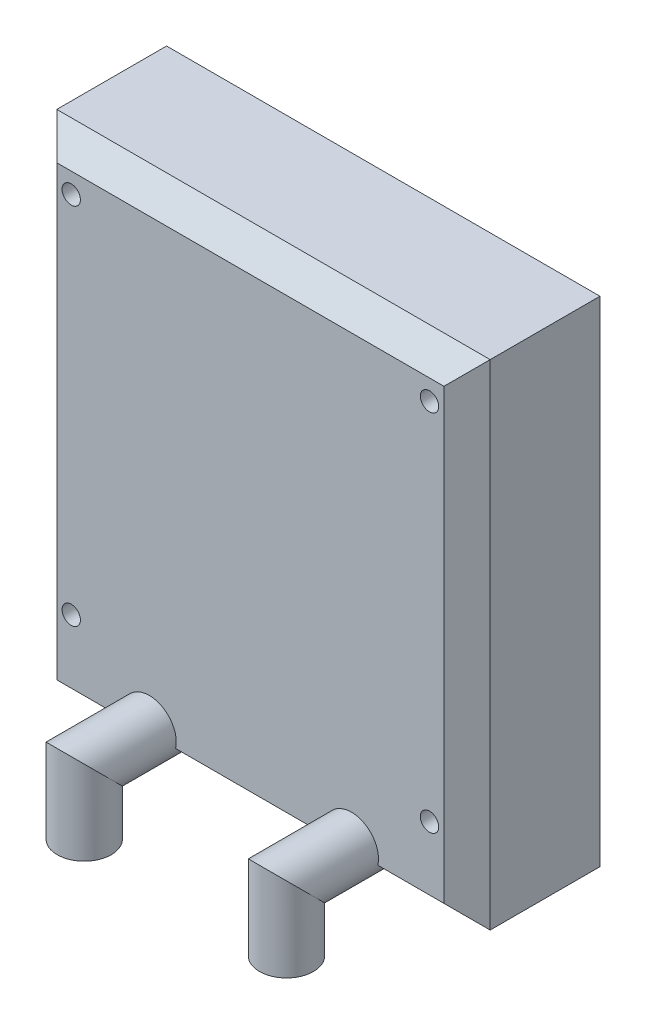
ISO-10303-21;
HEADER;
FILE_DESCRIPTION(('STEP AP214'),'2;1');
FILE_NAME('part.step','',(''),(''),'','','');
FILE_SCHEMA(('AUTOMOTIVE_DESIGN { 1 0 10303 214 1 1 1 1 }'));
ENDSEC;
DATA;
#1=APPLICATION_CONTEXT('core data for automotive mechanical design processes');
#2=APPLICATION_PROTOCOL_DEFINITION('international standard','automotive_design',2000,#1);
#3=PRODUCT_CONTEXT('',#1,'mechanical');
#4=PRODUCT('Part','Part','',(#3));
#5=PRODUCT_RELATED_PRODUCT_CATEGORY('part','',(#4));
#6=PRODUCT_DEFINITION_FORMATION('','',#4);
#7=PRODUCT_DEFINITION_CONTEXT('part definition',#1,'design');
#8=PRODUCT_DEFINITION('design','',#6,#7);
#9=PRODUCT_DEFINITION_SHAPE('','',#8);
#10=(LENGTH_UNIT() NAMED_UNIT(*) SI_UNIT(.MILLI.,.METRE.));
#11=(NAMED_UNIT(*) PLANE_ANGLE_UNIT() SI_UNIT($,.RADIAN.));
#12=(NAMED_UNIT(*) SI_UNIT($,.STERADIAN.) SOLID_ANGLE_UNIT());
#13=UNCERTAINTY_MEASURE_WITH_UNIT(LENGTH_MEASURE(1.E-05),#10,'distance_accuracy_value','');
#14=(GEOMETRIC_REPRESENTATION_CONTEXT(3) GLOBAL_UNCERTAINTY_ASSIGNED_CONTEXT((#13)) GLOBAL_UNIT_ASSIGNED_CONTEXT((#10,
#11,#12)) REPRESENTATION_CONTEXT('',''));
#15=CARTESIAN_POINT('',(0.,0.,0.));
#16=DIRECTION('',(0.,0.,1.));
#17=DIRECTION('',(1.,0.,0.));
#18=AXIS2_PLACEMENT_3D('',#15,#16,#17);
#19=CARTESIAN_POINT('',(-75.,-85.5,54.));
#20=DIRECTION('',(-1.,0.,0.));
#21=DIRECTION('',(0.,0.,1.));
#22=AXIS2_PLACEMENT_3D('',#19,#20,#21);
#23=PLANE('',#22);
#24=DIRECTION('',(0.,0.,-1.));
#25=VECTOR('',#24,1.);
#26=CARTESIAN_POINT('',(-75.,85.5,54.));
#27=LINE('',#26,#25);
#28=CARTESIAN_POINT('',(-75.,85.5,46.));
#29=VERTEX_POINT('',#28);
#30=CARTESIAN_POINT('',(-75.,85.5,8.00000000000004));
#31=VERTEX_POINT('',#30);
#32=EDGE_CURVE('E186',#29,#31,#27,.T.);
#33=ORIENTED_EDGE('',*,*,#32,.T.);
#34=DIRECTION('',(0.,-1.,0.));
#35=VECTOR('',#34,1.);
#36=CARTESIAN_POINT('',(-75.,-85.5,8.00000000000004));
#37=LINE('',#36,#35);
#38=CARTESIAN_POINT('',(-75.,-85.5,8.00000000000004));
#39=VERTEX_POINT('',#38);
#40=EDGE_CURVE('E217',#31,#39,#37,.T.);
#41=ORIENTED_EDGE('',*,*,#40,.T.);
#42=DIRECTION('',(0.,0.,-1.));
#43=VECTOR('',#42,1.);
#44=CARTESIAN_POINT('',(-75.,-85.5,54.));
#45=LINE('',#44,#43);
#46=CARTESIAN_POINT('',(-75.,-85.5,46.));
#47=VERTEX_POINT('',#46);
#48=EDGE_CURVE('E189',#47,#39,#45,.T.);
#49=ORIENTED_EDGE('',*,*,#48,.F.);
#50=DIRECTION('',(0.,1.,0.));
#51=VECTOR('',#50,1.);
#52=CARTESIAN_POINT('',(-75.,85.5,46.));
#53=LINE('',#52,#51);
#54=EDGE_CURVE('E215',#47,#29,#53,.T.);
#55=ORIENTED_EDGE('',*,*,#54,.T.);
#56=EDGE_LOOP('',(#33,#41,#49,#55));
#57=FACE_BOUND('',#56,.T.);
#58=ADVANCED_FACE('F34',(#57),#23,.T.);
#59=CARTESIAN_POINT('',(-75.,-85.5,54.));
#60=DIRECTION('',(0.,1.,0.));
#61=DIRECTION('',(0.,0.,1.));
#62=AXIS2_PLACEMENT_3D('',#59,#60,#61);
#63=PLANE('',#62);
#64=ORIENTED_EDGE('',*,*,#48,.T.);
#65=DIRECTION('',(1.,0.,0.));
#66=VECTOR('',#65,1.);
#67=CARTESIAN_POINT('',(75.,-85.5,8.00000000000004));
#68=LINE('',#67,#66);
#69=CARTESIAN_POINT('',(75.,-85.5,8.00000000000004));
#70=VERTEX_POINT('',#69);
#71=EDGE_CURVE('E221',#39,#70,#68,.T.);
#72=ORIENTED_EDGE('',*,*,#71,.T.);
#73=DIRECTION('',(0.,0.,-1.));
#74=VECTOR('',#73,1.);
#75=CARTESIAN_POINT('',(75.,-85.5,54.));
#76=LINE('',#75,#74);
#77=CARTESIAN_POINT('',(75.,-85.5,46.));
#78=VERTEX_POINT('',#77);
#79=EDGE_CURVE('E193',#78,#70,#76,.T.);
#80=ORIENTED_EDGE('',*,*,#79,.F.);
#81=DIRECTION('',(-1.,0.,0.));
#82=VECTOR('',#81,1.);
#83=CARTESIAN_POINT('',(-75.,-85.5,46.));
#84=LINE('',#83,#82);
#85=EDGE_CURVE('E219',#78,#47,#84,.T.);
#86=ORIENTED_EDGE('',*,*,#85,.T.);
#87=EDGE_LOOP('',(#64,#72,#80,#86));
#88=FACE_BOUND('',#87,.T.);
#89=ADVANCED_FACE('F298',(#88),#63,.F.);
#90=CARTESIAN_POINT('',(75.,-85.5,54.));
#91=DIRECTION('',(-1.,0.,0.));
#92=DIRECTION('',(0.,0.,1.));
#93=AXIS2_PLACEMENT_3D('',#90,#91,#92);
#94=PLANE('',#93);
#95=ORIENTED_EDGE('',*,*,#79,.T.);
#96=DIRECTION('',(0.,1.,0.));
#97=VECTOR('',#96,1.);
#98=CARTESIAN_POINT('',(75.,85.5,8.00000000000004));
#99=LINE('',#98,#97);
#100=CARTESIAN_POINT('',(75.,85.5,8.00000000000004));
#101=VERTEX_POINT('',#100);
#102=EDGE_CURVE('E225',#70,#101,#99,.T.);
#103=ORIENTED_EDGE('',*,*,#102,.T.);
#104=DIRECTION('',(0.,0.,-1.));
#105=VECTOR('',#104,1.);
#106=CARTESIAN_POINT('',(75.,85.5,54.));
#107=LINE('',#106,#105);
#108=CARTESIAN_POINT('',(75.,85.5,46.));
#109=VERTEX_POINT('',#108);
#110=EDGE_CURVE('E196',#109,#101,#107,.T.);
#111=ORIENTED_EDGE('',*,*,#110,.F.);
#112=DIRECTION('',(0.,-1.,0.));
#113=VECTOR('',#112,1.);
#114=CARTESIAN_POINT('',(75.,-85.5,46.));
#115=LINE('',#114,#113);
#116=EDGE_CURVE('E223',#109,#78,#115,.T.);
#117=ORIENTED_EDGE('',*,*,#116,.T.);
#118=EDGE_LOOP('',(#95,#103,#111,#117));
#119=FACE_BOUND('',#118,.T.);
#120=ADVANCED_FACE('F319',(#119),#94,.F.);
#121=CARTESIAN_POINT('',(-75.,85.5,54.));
#122=DIRECTION('',(0.,1.,0.));
#123=DIRECTION('',(0.,0.,1.));
#124=AXIS2_PLACEMENT_3D('',#121,#122,#123);
#125=PLANE('',#124);
#126=ORIENTED_EDGE('',*,*,#110,.T.);
#127=DIRECTION('',(-1.,0.,0.));
#128=VECTOR('',#127,1.);
#129=CARTESIAN_POINT('',(-75.,85.5,8.00000000000004));
#130=LINE('',#129,#128);
#131=EDGE_CURVE('E212',#101,#31,#130,.T.);
#132=ORIENTED_EDGE('',*,*,#131,.T.);
#133=ORIENTED_EDGE('',*,*,#32,.F.);
#134=DIRECTION('',(1.,0.,0.));
#135=VECTOR('',#134,1.);
#136=CARTESIAN_POINT('',(75.,85.5,46.));
#137=LINE('',#136,#135);
#138=EDGE_CURVE('E209',#29,#109,#137,.T.);
#139=ORIENTED_EDGE('',*,*,#138,.T.);
#140=EDGE_LOOP('',(#126,#132,#133,#139));
#141=FACE_BOUND('',#140,.T.);
#142=ADVANCED_FACE('F274',(#141),#125,.T.);
#143=CARTESIAN_POINT('',(0.,0.,54.));
#144=DIRECTION('',(0.,0.,-1.));
#145=DIRECTION('',(-1.,0.,0.));
#146=AXIS2_PLACEMENT_3D('',#143,#144,#145);
#147=PLANE('',#146);
#148=DIRECTION('',(1.,0.,0.));
#149=VECTOR('',#148,1.);
#150=CARTESIAN_POINT('',(0.,-77.4999999999999,54.));
#151=LINE('',#150,#149);
#152=CARTESIAN_POINT('',(-25.8664081545101,-77.4999999999999,54.));
#153=VERTEX_POINT('',#152);
#154=CARTESIAN_POINT('',(25.8664081545101,-77.4999999999999,54.));
#155=VERTEX_POINT('',#154);
#156=EDGE_CURVE('E233',#153,#155,#151,.T.);
#157=ORIENTED_EDGE('',*,*,#156,.T.);
#158=CARTESIAN_POINT('',(35.,-75.5,54.));
#159=DIRECTION('',(0.,0.,-1.));
#160=DIRECTION('',(-1.,0.,0.));
#161=AXIS2_PLACEMENT_3D('',#158,#159,#160);
#162=CIRCLE('',#161,9.35);
#163=CARTESIAN_POINT('',(44.1335918454899,-77.4999999999999,54.));
#164=VERTEX_POINT('',#163);
#165=EDGE_CURVE('E123',#155,#164,#162,.T.);
#166=ORIENTED_EDGE('',*,*,#165,.T.);
#167=CARTESIAN_POINT('',(66.9999999999999,-77.4999999999999,54.));
#168=VERTEX_POINT('',#167);
#169=EDGE_CURVE('E229',#164,#168,#151,.T.);
#170=ORIENTED_EDGE('',*,*,#169,.T.);
#171=DIRECTION('',(0.,1.,0.));
#172=VECTOR('',#171,1.);
#173=CARTESIAN_POINT('',(66.9999999999999,0.,54.));
#174=LINE('',#173,#172);
#175=CARTESIAN_POINT('',(66.9999999999999,77.4999999999999,54.));
#176=VERTEX_POINT('',#175);
#177=EDGE_CURVE('E232',#168,#176,#174,.T.);
#178=ORIENTED_EDGE('',*,*,#177,.T.);
#179=DIRECTION('',(-1.,0.,0.));
#180=VECTOR('',#179,1.);
#181=CARTESIAN_POINT('',(-75.,77.4999999999999,54.));
#182=LINE('',#181,#180);
#183=CARTESIAN_POINT('',(-66.9999999999999,77.4999999999999,54.));
#184=VERTEX_POINT('',#183);
#185=EDGE_CURVE('E235',#176,#184,#182,.T.);
#186=ORIENTED_EDGE('',*,*,#185,.T.);
#187=DIRECTION('',(0.,-1.,0.));
#188=VECTOR('',#187,1.);
#189=CARTESIAN_POINT('',(-66.9999999999999,-85.5,54.));
#190=LINE('',#189,#188);
#191=CARTESIAN_POINT('',(-66.9999999999999,-77.4999999999999,54.));
#192=VERTEX_POINT('',#191);
#193=EDGE_CURVE('E227',#184,#192,#190,.T.);
#194=ORIENTED_EDGE('',*,*,#193,.T.);
#195=CARTESIAN_POINT('',(-44.1335918454899,-77.4999999999999,54.));
#196=VERTEX_POINT('',#195);
#197=EDGE_CURVE('E230',#192,#196,#151,.T.);
#198=ORIENTED_EDGE('',*,*,#197,.T.);
#199=CARTESIAN_POINT('',(-35.,-75.5,54.));
#200=DIRECTION('',(0.,0.,-1.));
#201=DIRECTION('',(-1.,0.,0.));
#202=AXIS2_PLACEMENT_3D('',#199,#200,#201);
#203=CIRCLE('',#202,9.35);
#204=EDGE_CURVE('E134',#196,#153,#203,.T.);
#205=ORIENTED_EDGE('',*,*,#204,.T.);
#206=EDGE_LOOP('',(#157,#166,#170,#178,#186,#194,#198,#205));
#207=FACE_BOUND('',#206,.T.);
#208=CARTESIAN_POINT('',(-62.,-55.5,54.));
#209=DIRECTION('',(0.,0.,1.));
#210=DIRECTION('',(1.,0.,0.));
#211=AXIS2_PLACEMENT_3D('',#208,#209,#210);
#212=CIRCLE('',#211,3.175);
#213=CARTESIAN_POINT('',(-58.825,-55.5,54.));
#214=VERTEX_POINT('',#213);
#215=EDGE_CURVE('E162',#214,#214,#212,.T.);
#216=ORIENTED_EDGE('',*,*,#215,.F.);
#217=EDGE_LOOP('',(#216));
#218=FACE_BOUND('',#217,.T.);
#219=CARTESIAN_POINT('',(62.,-55.5,54.));
#220=DIRECTION('',(0.,0.,1.));
#221=DIRECTION('',(1.,0.,0.));
#222=AXIS2_PLACEMENT_3D('',#219,#220,#221);
#223=CIRCLE('',#222,3.175);
#224=CARTESIAN_POINT('',(65.175,-55.5,54.));
#225=VERTEX_POINT('',#224);
#226=EDGE_CURVE('E175',#225,#225,#223,.T.);
#227=ORIENTED_EDGE('',*,*,#226,.F.);
#228=EDGE_LOOP('',(#227));
#229=FACE_BOUND('',#228,.T.);
#230=CARTESIAN_POINT('',(62.,70.5,54.));
#231=DIRECTION('',(0.,0.,1.));
#232=DIRECTION('',(1.,0.,0.));
#233=AXIS2_PLACEMENT_3D('',#230,#231,#232);
#234=CIRCLE('',#233,3.175);
#235=CARTESIAN_POINT('',(65.175,70.5,54.));
#236=VERTEX_POINT('',#235);
#237=EDGE_CURVE('E169',#236,#236,#234,.T.);
#238=ORIENTED_EDGE('',*,*,#237,.F.);
#239=EDGE_LOOP('',(#238));
#240=FACE_BOUND('',#239,.T.);
#241=CARTESIAN_POINT('',(-62.,70.5,54.));
#242=DIRECTION('',(0.,0.,1.));
#243=DIRECTION('',(1.,0.,0.));
#244=AXIS2_PLACEMENT_3D('',#241,#242,#243);
#245=CIRCLE('',#244,3.175);
#246=CARTESIAN_POINT('',(-58.825,70.5,54.));
#247=VERTEX_POINT('',#246);
#248=EDGE_CURVE('E168',#247,#247,#245,.T.);
#249=ORIENTED_EDGE('',*,*,#248,.F.);
#250=EDGE_LOOP('',(#249));
#251=FACE_BOUND('',#250,.T.);
#252=ADVANCED_FACE('F259',(#207,#218,#229,#240,#251),#147,.F.);
#253=CARTESIAN_POINT('',(0.,0.,0.));
#254=DIRECTION('',(0.,0.,-1.));
#255=DIRECTION('',(-1.,0.,0.));
#256=AXIS2_PLACEMENT_3D('',#253,#254,#255);
#257=PLANE('',#256);
#258=DIRECTION('',(0.,1.,0.));
#259=VECTOR('',#258,1.);
#260=CARTESIAN_POINT('',(-66.9999999999999,0.,0.));
#261=LINE('',#260,#259);
#262=CARTESIAN_POINT('',(-66.9999999999999,-77.4999999999999,0.));
#263=VERTEX_POINT('',#262);
#264=CARTESIAN_POINT('',(-66.9999999999999,77.4999999999999,0.));
#265=VERTEX_POINT('',#264);
#266=EDGE_CURVE('E204',#263,#265,#261,.T.);
#267=ORIENTED_EDGE('',*,*,#266,.T.);
#268=DIRECTION('',(1.,0.,0.));
#269=VECTOR('',#268,1.);
#270=CARTESIAN_POINT('',(0.,77.4999999999999,0.));
#271=LINE('',#270,#269);
#272=CARTESIAN_POINT('',(66.9999999999999,77.4999999999999,0.));
#273=VERTEX_POINT('',#272);
#274=EDGE_CURVE('E206',#265,#273,#271,.T.);
#275=ORIENTED_EDGE('',*,*,#274,.T.);
#276=DIRECTION('',(0.,-1.,0.));
#277=VECTOR('',#276,1.);
#278=CARTESIAN_POINT('',(66.9999999999999,-85.5,0.));
#279=LINE('',#278,#277);
#280=CARTESIAN_POINT('',(66.9999999999999,-77.4999999999999,0.));
#281=VERTEX_POINT('',#280);
#282=EDGE_CURVE('E192',#273,#281,#279,.T.);
#283=ORIENTED_EDGE('',*,*,#282,.T.);
#284=DIRECTION('',(-1.,0.,0.));
#285=VECTOR('',#284,1.);
#286=CARTESIAN_POINT('',(-75.,-77.4999999999999,0.));
#287=LINE('',#286,#285);
#288=EDGE_CURVE('E202',#281,#263,#287,.T.);
#289=ORIENTED_EDGE('',*,*,#288,.T.);
#290=EDGE_LOOP('',(#267,#275,#283,#289));
#291=FACE_BOUND('',#290,.T.);
#292=CARTESIAN_POINT('',(-62.,-55.5,0.));
#293=DIRECTION('',(0.,0.,1.));
#294=DIRECTION('',(1.,0.,0.));
#295=AXIS2_PLACEMENT_3D('',#292,#293,#294);
#296=CIRCLE('',#295,3.175);
#297=CARTESIAN_POINT('',(-58.825,-55.5,0.));
#298=VERTEX_POINT('',#297);
#299=EDGE_CURVE('E155',#298,#298,#296,.T.);
#300=ORIENTED_EDGE('',*,*,#299,.T.);
#301=EDGE_LOOP('',(#300));
#302=FACE_BOUND('',#301,.T.);
#303=CARTESIAN_POINT('',(62.,-55.5,0.));
#304=DIRECTION('',(0.,0.,1.));
#305=DIRECTION('',(1.,0.,0.));
#306=AXIS2_PLACEMENT_3D('',#303,#304,#305);
#307=CIRCLE('',#306,3.175);
#308=CARTESIAN_POINT('',(65.175,-55.5,0.));
#309=VERTEX_POINT('',#308);
#310=EDGE_CURVE('E149',#309,#309,#307,.T.);
#311=ORIENTED_EDGE('',*,*,#310,.T.);
#312=EDGE_LOOP('',(#311));
#313=FACE_BOUND('',#312,.T.);
#314=CARTESIAN_POINT('',(62.,70.5,0.));
#315=DIRECTION('',(0.,0.,1.));
#316=DIRECTION('',(1.,0.,0.));
#317=AXIS2_PLACEMENT_3D('',#314,#315,#316);
#318=CIRCLE('',#317,3.175);
#319=CARTESIAN_POINT('',(65.175,70.5,0.));
#320=VERTEX_POINT('',#319);
#321=EDGE_CURVE('E143',#320,#320,#318,.T.);
#322=ORIENTED_EDGE('',*,*,#321,.T.);
#323=EDGE_LOOP('',(#322));
#324=FACE_BOUND('',#323,.T.);
#325=CARTESIAN_POINT('',(-62.,70.5,0.));
#326=DIRECTION('',(0.,0.,1.));
#327=DIRECTION('',(1.,0.,0.));
#328=AXIS2_PLACEMENT_3D('',#325,#326,#327);
#329=CIRCLE('',#328,3.175);
#330=CARTESIAN_POINT('',(-58.825,70.5,0.));
#331=VERTEX_POINT('',#330);
#332=EDGE_CURVE('E142',#331,#331,#329,.T.);
#333=ORIENTED_EDGE('',*,*,#332,.T.);
#334=EDGE_LOOP('',(#333));
#335=FACE_BOUND('',#334,.T.);
#336=ADVANCED_FACE('F290',(#291,#302,#313,#324,#335),#257,.T.);
#337=CARTESIAN_POINT('',(-62.,70.5,48.92));
#338=DIRECTION('',(0.,0.,1.));
#339=DIRECTION('',(1.,0.,0.));
#340=AXIS2_PLACEMENT_3D('',#337,#338,#339);
#341=CYLINDRICAL_SURFACE('',#340,3.175);
#342=CARTESIAN_POINT('',(-62.,70.5,48.92));
#343=DIRECTION('',(0.,0.,1.));
#344=DIRECTION('',(1.,0.,0.));
#345=AXIS2_PLACEMENT_3D('',#342,#343,#344);
#346=CIRCLE('',#345,3.175);
#347=CARTESIAN_POINT('',(-58.825,70.5,48.92));
#348=VERTEX_POINT('',#347);
#349=EDGE_CURVE('E183',#348,#348,#346,.T.);
#350=ORIENTED_EDGE('',*,*,#349,.F.);
#351=EDGE_LOOP('',(#350));
#352=FACE_BOUND('',#351,.T.);
#353=ORIENTED_EDGE('',*,*,#248,.T.);
#354=EDGE_LOOP('',(#353));
#355=FACE_BOUND('',#354,.T.);
#356=ADVANCED_FACE('F568',(#352,#355),#341,.F.);
#357=CARTESIAN_POINT('',(-62.,70.5,48.92));
#358=DIRECTION('',(0.,0.,1.));
#359=DIRECTION('',(1.,0.,0.));
#360=AXIS2_PLACEMENT_3D('',#357,#358,#359);
#361=PLANE('',#360);
#362=ORIENTED_EDGE('',*,*,#349,.T.);
#363=EDGE_LOOP('',(#362));
#364=FACE_BOUND('',#363,.T.);
#365=ADVANCED_FACE('F559',(#364),#361,.T.);
#366=CARTESIAN_POINT('',(62.,70.5,48.92));
#367=DIRECTION('',(0.,0.,1.));
#368=DIRECTION('',(1.,0.,0.));
#369=AXIS2_PLACEMENT_3D('',#366,#367,#368);
#370=CYLINDRICAL_SURFACE('',#369,3.175);
#371=CARTESIAN_POINT('',(62.,70.5,48.92));
#372=DIRECTION('',(0.,0.,1.));
#373=DIRECTION('',(1.,0.,0.));
#374=AXIS2_PLACEMENT_3D('',#371,#372,#373);
#375=CIRCLE('',#374,3.175);
#376=CARTESIAN_POINT('',(65.175,70.5,48.92));
#377=VERTEX_POINT('',#376);
#378=EDGE_CURVE('E165',#377,#377,#375,.T.);
#379=ORIENTED_EDGE('',*,*,#378,.F.);
#380=EDGE_LOOP('',(#379));
#381=FACE_BOUND('',#380,.T.);
#382=ORIENTED_EDGE('',*,*,#237,.T.);
#383=EDGE_LOOP('',(#382));
#384=FACE_BOUND('',#383,.T.);
#385=ADVANCED_FACE('F550',(#381,#384),#370,.F.);
#386=CARTESIAN_POINT('',(62.,70.5,48.92));
#387=DIRECTION('',(0.,0.,1.));
#388=DIRECTION('',(1.,0.,0.));
#389=AXIS2_PLACEMENT_3D('',#386,#387,#388);
#390=PLANE('',#389);
#391=ORIENTED_EDGE('',*,*,#378,.T.);
#392=EDGE_LOOP('',(#391));
#393=FACE_BOUND('',#392,.T.);
#394=ADVANCED_FACE('F541',(#393),#390,.T.);
#395=CARTESIAN_POINT('',(62.,-55.5,48.92));
#396=DIRECTION('',(0.,0.,1.));
#397=DIRECTION('',(1.,0.,0.));
#398=AXIS2_PLACEMENT_3D('',#395,#396,#397);
#399=CYLINDRICAL_SURFACE('',#398,3.175);
#400=CARTESIAN_POINT('',(62.,-55.5,48.92));
#401=DIRECTION('',(0.,0.,1.));
#402=DIRECTION('',(1.,0.,0.));
#403=AXIS2_PLACEMENT_3D('',#400,#401,#402);
#404=CIRCLE('',#403,3.175);
#405=CARTESIAN_POINT('',(65.175,-55.5,48.92));
#406=VERTEX_POINT('',#405);
#407=EDGE_CURVE('E172',#406,#406,#404,.T.);
#408=ORIENTED_EDGE('',*,*,#407,.F.);
#409=EDGE_LOOP('',(#408));
#410=FACE_BOUND('',#409,.T.);
#411=ORIENTED_EDGE('',*,*,#226,.T.);
#412=EDGE_LOOP('',(#411));
#413=FACE_BOUND('',#412,.T.);
#414=ADVANCED_FACE('F532',(#410,#413),#399,.F.);
#415=CARTESIAN_POINT('',(62.,-55.5,48.92));
#416=DIRECTION('',(0.,0.,1.));
#417=DIRECTION('',(1.,0.,0.));
#418=AXIS2_PLACEMENT_3D('',#415,#416,#417);
#419=PLANE('',#418);
#420=ORIENTED_EDGE('',*,*,#407,.T.);
#421=EDGE_LOOP('',(#420));
#422=FACE_BOUND('',#421,.T.);
#423=ADVANCED_FACE('F523',(#422),#419,.T.);
#424=CARTESIAN_POINT('',(-62.,-55.5,48.92));
#425=DIRECTION('',(0.,0.,1.));
#426=DIRECTION('',(1.,0.,0.));
#427=AXIS2_PLACEMENT_3D('',#424,#425,#426);
#428=CYLINDRICAL_SURFACE('',#427,3.175);
#429=CARTESIAN_POINT('',(-62.,-55.5,48.92));
#430=DIRECTION('',(0.,0.,1.));
#431=DIRECTION('',(1.,0.,0.));
#432=AXIS2_PLACEMENT_3D('',#429,#430,#431);
#433=CIRCLE('',#432,3.175);
#434=CARTESIAN_POINT('',(-58.825,-55.5,48.92));
#435=VERTEX_POINT('',#434);
#436=EDGE_CURVE('E178',#435,#435,#433,.T.);
#437=ORIENTED_EDGE('',*,*,#436,.F.);
#438=EDGE_LOOP('',(#437));
#439=FACE_BOUND('',#438,.T.);
#440=ORIENTED_EDGE('',*,*,#215,.T.);
#441=EDGE_LOOP('',(#440));
#442=FACE_BOUND('',#441,.T.);
#443=ADVANCED_FACE('F514',(#439,#442),#428,.F.);
#444=CARTESIAN_POINT('',(-62.,-55.5,48.92));
#445=DIRECTION('',(0.,0.,1.));
#446=DIRECTION('',(1.,0.,0.));
#447=AXIS2_PLACEMENT_3D('',#444,#445,#446);
#448=PLANE('',#447);
#449=ORIENTED_EDGE('',*,*,#436,.T.);
#450=EDGE_LOOP('',(#449));
#451=FACE_BOUND('',#450,.T.);
#452=ADVANCED_FACE('F505',(#451),#448,.T.);
#453=CARTESIAN_POINT('',(-62.,70.5,5.08));
#454=DIRECTION('',(0.,0.,-1.));
#455=DIRECTION('',(-1.,0.,0.));
#456=AXIS2_PLACEMENT_3D('',#453,#454,#455);
#457=CYLINDRICAL_SURFACE('',#456,3.175);
#458=CARTESIAN_POINT('',(-62.,70.5,5.08));
#459=DIRECTION('',(0.,0.,1.));
#460=DIRECTION('',(1.,0.,0.));
#461=AXIS2_PLACEMENT_3D('',#458,#459,#460);
#462=CIRCLE('',#461,3.175);
#463=CARTESIAN_POINT('',(-58.825,70.5,5.08));
#464=VERTEX_POINT('',#463);
#465=EDGE_CURVE('E159',#464,#464,#462,.T.);
#466=ORIENTED_EDGE('',*,*,#465,.T.);
#467=EDGE_LOOP('',(#466));
#468=FACE_BOUND('',#467,.T.);
#469=ORIENTED_EDGE('',*,*,#332,.F.);
#470=EDGE_LOOP('',(#469));
#471=FACE_BOUND('',#470,.T.);
#472=ADVANCED_FACE('F496',(#468,#471),#457,.F.);
#473=CARTESIAN_POINT('',(-62.,70.5,5.08));
#474=DIRECTION('',(0.,0.,-1.));
#475=DIRECTION('',(1.,0.,0.));
#476=AXIS2_PLACEMENT_3D('',#473,#474,#475);
#477=PLANE('',#476);
#478=ORIENTED_EDGE('',*,*,#465,.F.);
#479=EDGE_LOOP('',(#478));
#480=FACE_BOUND('',#479,.T.);
#481=ADVANCED_FACE('F487',(#480),#477,.T.);
#482=CARTESIAN_POINT('',(62.,70.5,5.08));
#483=DIRECTION('',(0.,0.,-1.));
#484=DIRECTION('',(-1.,0.,0.));
#485=AXIS2_PLACEMENT_3D('',#482,#483,#484);
#486=CYLINDRICAL_SURFACE('',#485,3.175);
#487=CARTESIAN_POINT('',(62.,70.5,5.08));
#488=DIRECTION('',(0.,0.,1.));
#489=DIRECTION('',(1.,0.,0.));
#490=AXIS2_PLACEMENT_3D('',#487,#488,#489);
#491=CIRCLE('',#490,3.175);
#492=CARTESIAN_POINT('',(65.175,70.5,5.08));
#493=VERTEX_POINT('',#492);
#494=EDGE_CURVE('E139',#493,#493,#491,.T.);
#495=ORIENTED_EDGE('',*,*,#494,.T.);
#496=EDGE_LOOP('',(#495));
#497=FACE_BOUND('',#496,.T.);
#498=ORIENTED_EDGE('',*,*,#321,.F.);
#499=EDGE_LOOP('',(#498));
#500=FACE_BOUND('',#499,.T.);
#501=ADVANCED_FACE('F478',(#497,#500),#486,.F.);
#502=CARTESIAN_POINT('',(62.,70.5,5.08));
#503=DIRECTION('',(0.,0.,-1.));
#504=DIRECTION('',(1.,0.,0.));
#505=AXIS2_PLACEMENT_3D('',#502,#503,#504);
#506=PLANE('',#505);
#507=ORIENTED_EDGE('',*,*,#494,.F.);
#508=EDGE_LOOP('',(#507));
#509=FACE_BOUND('',#508,.T.);
#510=ADVANCED_FACE('F469',(#509),#506,.T.);
#511=CARTESIAN_POINT('',(62.,-55.5,5.08));
#512=DIRECTION('',(0.,0.,-1.));
#513=DIRECTION('',(-1.,0.,0.));
#514=AXIS2_PLACEMENT_3D('',#511,#512,#513);
#515=CYLINDRICAL_SURFACE('',#514,3.175);
#516=CARTESIAN_POINT('',(62.,-55.5,5.08));
#517=DIRECTION('',(0.,0.,1.));
#518=DIRECTION('',(1.,0.,0.));
#519=AXIS2_PLACEMENT_3D('',#516,#517,#518);
#520=CIRCLE('',#519,3.175);
#521=CARTESIAN_POINT('',(65.175,-55.5,5.08));
#522=VERTEX_POINT('',#521);
#523=EDGE_CURVE('E146',#522,#522,#520,.T.);
#524=ORIENTED_EDGE('',*,*,#523,.T.);
#525=EDGE_LOOP('',(#524));
#526=FACE_BOUND('',#525,.T.);
#527=ORIENTED_EDGE('',*,*,#310,.F.);
#528=EDGE_LOOP('',(#527));
#529=FACE_BOUND('',#528,.T.);
#530=ADVANCED_FACE('F460',(#526,#529),#515,.F.);
#531=CARTESIAN_POINT('',(62.,-55.5,5.08));
#532=DIRECTION('',(0.,0.,-1.));
#533=DIRECTION('',(1.,0.,0.));
#534=AXIS2_PLACEMENT_3D('',#531,#532,#533);
#535=PLANE('',#534);
#536=ORIENTED_EDGE('',*,*,#523,.F.);
#537=EDGE_LOOP('',(#536));
#538=FACE_BOUND('',#537,.T.);
#539=ADVANCED_FACE('F451',(#538),#535,.T.);
#540=CARTESIAN_POINT('',(-62.,-55.5,5.08));
#541=DIRECTION('',(0.,0.,-1.));
#542=DIRECTION('',(-1.,0.,0.));
#543=AXIS2_PLACEMENT_3D('',#540,#541,#542);
#544=CYLINDRICAL_SURFACE('',#543,3.175);
#545=CARTESIAN_POINT('',(-62.,-55.5,5.08));
#546=DIRECTION('',(0.,0.,1.));
#547=DIRECTION('',(1.,0.,0.));
#548=AXIS2_PLACEMENT_3D('',#545,#546,#547);
#549=CIRCLE('',#548,3.175);
#550=CARTESIAN_POINT('',(-58.825,-55.5,5.08));
#551=VERTEX_POINT('',#550);
#552=EDGE_CURVE('E152',#551,#551,#549,.T.);
#553=ORIENTED_EDGE('',*,*,#552,.T.);
#554=EDGE_LOOP('',(#553));
#555=FACE_BOUND('',#554,.T.);
#556=ORIENTED_EDGE('',*,*,#299,.F.);
#557=EDGE_LOOP('',(#556));
#558=FACE_BOUND('',#557,.T.);
#559=ADVANCED_FACE('F310',(#555,#558),#544,.F.);
#560=CARTESIAN_POINT('',(-62.,-55.5,5.08));
#561=DIRECTION('',(0.,0.,-1.));
#562=DIRECTION('',(1.,0.,0.));
#563=AXIS2_PLACEMENT_3D('',#560,#561,#562);
#564=PLANE('',#563);
#565=ORIENTED_EDGE('',*,*,#552,.F.);
#566=EDGE_LOOP('',(#565));
#567=FACE_BOUND('',#566,.T.);
#568=ADVANCED_FACE('F303',(#567),#564,.T.);
#569=CARTESIAN_POINT('',(-75.,-85.5,8.00000000000004));
#570=DIRECTION('',(0.,-0.707106781186546,-0.707106781186549));
#571=DIRECTION('',(-1.,0.,0.));
#572=AXIS2_PLACEMENT_3D('',#569,#570,#571);
#573=PLANE('',#572);
#574=DIRECTION('',(-0.577350269189626,0.577350269189626,-0.577350269189624));
#575=VECTOR('',#574,1.);
#576=CARTESIAN_POINT('',(75.,-85.5,8.00000000000004));
#577=LINE('',#576,#575);
#578=EDGE_CURVE('E243',#70,#281,#577,.T.);
#579=ORIENTED_EDGE('',*,*,#578,.F.);
#580=ORIENTED_EDGE('',*,*,#71,.F.);
#581=DIRECTION('',(-0.577350269189626,-0.577350269189626,0.577350269189624));
#582=VECTOR('',#581,1.);
#583=CARTESIAN_POINT('',(-75.,-85.5,8.00000000000004));
#584=LINE('',#583,#582);
#585=EDGE_CURVE('E158',#263,#39,#584,.T.);
#586=ORIENTED_EDGE('',*,*,#585,.F.);
#587=ORIENTED_EDGE('',*,*,#288,.F.);
#588=EDGE_LOOP('',(#579,#580,#586,#587));
#589=FACE_BOUND('',#588,.T.);
#590=ADVANCED_FACE('F301',(#589),#573,.T.);
#591=CARTESIAN_POINT('',(-66.9999999999999,0.,0.));
#592=DIRECTION('',(0.707106781186546,0.,0.707106781186549));
#593=DIRECTION('',(0.,1.,0.));
#594=AXIS2_PLACEMENT_3D('',#591,#592,#593);
#595=PLANE('',#594);
#596=ORIENTED_EDGE('',*,*,#585,.T.);
#597=ORIENTED_EDGE('',*,*,#40,.F.);
#598=DIRECTION('',(0.577350269189626,-0.577350269189626,-0.577350269189624));
#599=VECTOR('',#598,1.);
#600=CARTESIAN_POINT('',(-41.1666666666666,51.6666666666666,-25.8333333333333));
#601=LINE('',#600,#599);
#602=EDGE_CURVE('E240',#265,#31,#601,.F.);
#603=ORIENTED_EDGE('',*,*,#602,.F.);
#604=ORIENTED_EDGE('',*,*,#266,.F.);
#605=EDGE_LOOP('',(#596,#597,#603,#604));
#606=FACE_BOUND('',#605,.T.);
#607=ADVANCED_FACE('F295',(#606),#595,.F.);
#608=CARTESIAN_POINT('',(75.,-85.5,8.00000000000004));
#609=DIRECTION('',(0.707106781186546,0.,-0.707106781186549));
#610=DIRECTION('',(0.,-1.,0.));
#611=AXIS2_PLACEMENT_3D('',#608,#609,#610);
#612=PLANE('',#611);
#613=ORIENTED_EDGE('',*,*,#578,.T.);
#614=ORIENTED_EDGE('',*,*,#282,.F.);
#615=DIRECTION('',(-0.577350269189626,-0.577350269189626,-0.577350269189624));
#616=VECTOR('',#615,1.);
#617=CARTESIAN_POINT('',(17.9999999999998,28.4999999999999,-48.9999999999999));
#618=LINE('',#617,#616);
#619=EDGE_CURVE('E238',#101,#273,#618,.T.);
#620=ORIENTED_EDGE('',*,*,#619,.F.);
#621=ORIENTED_EDGE('',*,*,#102,.F.);
#622=EDGE_LOOP('',(#613,#614,#620,#621));
#623=FACE_BOUND('',#622,.T.);
#624=ADVANCED_FACE('F286',(#623),#612,.T.);
#625=CARTESIAN_POINT('',(0.,77.4999999999999,0.));
#626=DIRECTION('',(0.,-0.707106781186546,0.707106781186549));
#627=DIRECTION('',(1.,0.,0.));
#628=AXIS2_PLACEMENT_3D('',#625,#626,#627);
#629=PLANE('',#628);
#630=ORIENTED_EDGE('',*,*,#602,.T.);
#631=ORIENTED_EDGE('',*,*,#131,.F.);
#632=ORIENTED_EDGE('',*,*,#619,.T.);
#633=ORIENTED_EDGE('',*,*,#274,.F.);
#634=EDGE_LOOP('',(#630,#631,#632,#633));
#635=FACE_BOUND('',#634,.T.);
#636=ADVANCED_FACE('F279',(#635),#629,.F.);
#637=CARTESIAN_POINT('',(0.,-77.4999999999999,54.));
#638=DIRECTION('',(0.,0.707106781186546,-0.707106781186549));
#639=DIRECTION('',(1.,0.,0.));
#640=AXIS2_PLACEMENT_3D('',#637,#638,#639);
#641=PLANE('',#640);
#642=CARTESIAN_POINT('',(35.,-75.5,55.9999999999999));
#643=DIRECTION('',(0.,0.707106781186546,-0.707106781186549));
#644=DIRECTION('',(0.,0.707106781186549,0.707106781186546));
#645=AXIS2_PLACEMENT_3D('',#642,#643,#644);
#646=ELLIPSE('',#645,13.2228968081884,9.35);
#647=EDGE_CURVE('E11',#155,#164,#646,.F.);
#648=ORIENTED_EDGE('',*,*,#647,.F.);
#649=ORIENTED_EDGE('',*,*,#156,.F.);
#650=CARTESIAN_POINT('',(-35.,-75.5,55.9999999999999));
#651=DIRECTION('',(0.,0.707106781186546,-0.707106781186549));
#652=DIRECTION('',(0.,0.707106781186549,0.707106781186546));
#653=AXIS2_PLACEMENT_3D('',#650,#651,#652);
#654=ELLIPSE('',#653,13.2228968081884,9.35);
#655=EDGE_CURVE('E42',#196,#153,#654,.F.);
#656=ORIENTED_EDGE('',*,*,#655,.F.);
#657=ORIENTED_EDGE('',*,*,#197,.F.);
#658=DIRECTION('',(-0.577350269189626,-0.577350269189626,-0.577350269189624));
#659=VECTOR('',#658,1.);
#660=CARTESIAN_POINT('',(-75.,-85.5,46.));
#661=LINE('',#660,#659);
#662=EDGE_CURVE('E241',#47,#192,#661,.F.);
#663=ORIENTED_EDGE('',*,*,#662,.F.);
#664=ORIENTED_EDGE('',*,*,#85,.F.);
#665=DIRECTION('',(-0.577350269189626,0.577350269189626,0.577350269189624));
#666=VECTOR('',#665,1.);
#667=CARTESIAN_POINT('',(44.6666666666666,-55.1666666666666,76.3333333333333));
#668=LINE('',#667,#666);
#669=EDGE_CURVE('E251',#168,#78,#668,.F.);
#670=ORIENTED_EDGE('',*,*,#669,.F.);
#671=ORIENTED_EDGE('',*,*,#169,.F.);
#672=EDGE_LOOP('',(#648,#649,#656,#657,#663,#664,#670,#671));
#673=FACE_BOUND('',#672,.T.);
#674=ADVANCED_FACE('F36',(#673),#641,.F.);
#675=CARTESIAN_POINT('',(-75.,-85.5,46.));
#676=DIRECTION('',(-0.707106781186546,0.,0.707106781186549));
#677=DIRECTION('',(0.,-1.,0.));
#678=AXIS2_PLACEMENT_3D('',#675,#676,#677);
#679=PLANE('',#678);
#680=ORIENTED_EDGE('',*,*,#662,.T.);
#681=ORIENTED_EDGE('',*,*,#193,.F.);
#682=DIRECTION('',(-0.577350269189626,0.577350269189626,-0.577350269189624));
#683=VECTOR('',#682,1.);
#684=CARTESIAN_POINT('',(-17.9999999999999,28.4999999999999,103.));
#685=LINE('',#684,#683);
#686=EDGE_CURVE('E249',#29,#184,#685,.F.);
#687=ORIENTED_EDGE('',*,*,#686,.F.);
#688=ORIENTED_EDGE('',*,*,#54,.F.);
#689=EDGE_LOOP('',(#680,#681,#687,#688));
#690=FACE_BOUND('',#689,.T.);
#691=ADVANCED_FACE('F267',(#690),#679,.T.);
#692=CARTESIAN_POINT('',(66.9999999999999,0.,54.));
#693=DIRECTION('',(-0.707106781186546,0.,-0.707106781186549));
#694=DIRECTION('',(0.,1.,0.));
#695=AXIS2_PLACEMENT_3D('',#692,#693,#694);
#696=PLANE('',#695);
#697=ORIENTED_EDGE('',*,*,#669,.T.);
#698=ORIENTED_EDGE('',*,*,#116,.F.);
#699=DIRECTION('',(0.577350269189626,0.577350269189626,-0.577350269189624));
#700=VECTOR('',#699,1.);
#701=CARTESIAN_POINT('',(41.1666666666665,51.6666666666666,79.8333333333333));
#702=LINE('',#701,#700);
#703=EDGE_CURVE('E138',#176,#109,#702,.T.);
#704=ORIENTED_EDGE('',*,*,#703,.F.);
#705=ORIENTED_EDGE('',*,*,#177,.F.);
#706=EDGE_LOOP('',(#697,#698,#704,#705));
#707=FACE_BOUND('',#706,.T.);
#708=ADVANCED_FACE('F348',(#707),#696,.F.);
#709=CARTESIAN_POINT('',(-75.,85.5,46.));
#710=DIRECTION('',(0.,0.707106781186546,0.707106781186549));
#711=DIRECTION('',(-1.,0.,0.));
#712=AXIS2_PLACEMENT_3D('',#709,#710,#711);
#713=PLANE('',#712);
#714=ORIENTED_EDGE('',*,*,#686,.T.);
#715=ORIENTED_EDGE('',*,*,#185,.F.);
#716=ORIENTED_EDGE('',*,*,#703,.T.);
#717=ORIENTED_EDGE('',*,*,#138,.F.);
#718=EDGE_LOOP('',(#714,#715,#716,#717));
#719=FACE_BOUND('',#718,.T.);
#720=ADVANCED_FACE('F354',(#719),#713,.T.);
#721=CARTESIAN_POINT('',(-35.,-75.5,44.));
#722=DIRECTION('',(0.,0.,1.));
#723=DIRECTION('',(1.,0.,0.));
#724=AXIS2_PLACEMENT_3D('',#721,#722,#723);
#725=CYLINDRICAL_SURFACE('',#724,9.35);
#726=CARTESIAN_POINT('',(-35.,-75.5,76.5));
#727=DIRECTION('',(0.,-0.707106781186548,0.707106781186548));
#728=DIRECTION('',(0.,0.707106781186548,0.707106781186548));
#729=AXIS2_PLACEMENT_3D('',#726,#727,#728);
#730=ELLIPSE('',#729,13.2228968081884,9.35);
#731=CARTESIAN_POINT('',(-35.,-66.15,85.85));
#732=VERTEX_POINT('',#731);
#733=EDGE_CURVE('E131',#732,#732,#730,.F.);
#734=ORIENTED_EDGE('',*,*,#733,.T.);
#735=EDGE_LOOP('',(#734));
#736=FACE_BOUND('',#735,.T.);
#737=ORIENTED_EDGE('',*,*,#204,.F.);
#738=ORIENTED_EDGE('',*,*,#655,.T.);
#739=EDGE_LOOP('',(#737,#738));
#740=FACE_BOUND('',#739,.T.);
#741=ADVANCED_FACE('F257',(#736,#740),#725,.T.);
#742=CARTESIAN_POINT('',(-35.,-98.,76.5));
#743=DIRECTION('',(0.,-1.,0.));
#744=DIRECTION('',(1.,0.,0.));
#745=AXIS2_PLACEMENT_3D('',#742,#743,#744);
#746=PLANE('',#745);
#747=CARTESIAN_POINT('',(-35.,-98.,76.5));
#748=DIRECTION('',(0.,-1.,0.));
#749=DIRECTION('',(1.,0.,0.));
#750=AXIS2_PLACEMENT_3D('',#747,#748,#749);
#751=CIRCLE('',#750,9.35);
#752=CARTESIAN_POINT('',(-25.65,-98.,76.5));
#753=VERTEX_POINT('',#752);
#754=EDGE_CURVE('E127',#753,#753,#751,.T.);
#755=ORIENTED_EDGE('',*,*,#754,.T.);
#756=EDGE_LOOP('',(#755));
#757=FACE_BOUND('',#756,.T.);
#758=ADVANCED_FACE('F368',(#757),#746,.T.);
#759=CARTESIAN_POINT('',(-35.,-54.83,76.5));
#760=DIRECTION('',(0.,-1.,0.));
#761=DIRECTION('',(0.,0.,-1.));
#762=AXIS2_PLACEMENT_3D('',#759,#760,#761);
#763=CYLINDRICAL_SURFACE('',#762,9.35);
#764=ORIENTED_EDGE('',*,*,#733,.F.);
#765=EDGE_LOOP('',(#764));
#766=FACE_BOUND('',#765,.T.);
#767=ORIENTED_EDGE('',*,*,#754,.F.);
#768=EDGE_LOOP('',(#767));
#769=FACE_BOUND('',#768,.T.);
#770=ADVANCED_FACE('F371',(#766,#769),#763,.T.);
#771=CARTESIAN_POINT('',(35.,-75.5,44.));
#772=DIRECTION('',(0.,0.,1.));
#773=DIRECTION('',(1.,0.,0.));
#774=AXIS2_PLACEMENT_3D('',#771,#772,#773);
#775=CYLINDRICAL_SURFACE('',#774,9.35);
#776=CARTESIAN_POINT('',(35.,-75.5,76.5));
#777=DIRECTION('',(0.,-0.707106781186548,0.707106781186548));
#778=DIRECTION('',(0.,0.707106781186548,0.707106781186548));
#779=AXIS2_PLACEMENT_3D('',#776,#777,#778);
#780=ELLIPSE('',#779,13.2228968081884,9.35);
#781=CARTESIAN_POINT('',(35.,-66.15,85.85));
#782=VERTEX_POINT('',#781);
#783=EDGE_CURVE('E119',#782,#782,#780,.F.);
#784=ORIENTED_EDGE('',*,*,#783,.T.);
#785=EDGE_LOOP('',(#784));
#786=FACE_BOUND('',#785,.T.);
#787=ORIENTED_EDGE('',*,*,#165,.F.);
#788=ORIENTED_EDGE('',*,*,#647,.T.);
#789=EDGE_LOOP('',(#787,#788));
#790=FACE_BOUND('',#789,.T.);
#791=ADVANCED_FACE('F379',(#786,#790),#775,.T.);
#792=CARTESIAN_POINT('',(35.,-98.,76.5));
#793=DIRECTION('',(0.,-1.,0.));
#794=DIRECTION('',(-1.,0.,0.));
#795=AXIS2_PLACEMENT_3D('',#792,#793,#794);
#796=PLANE('',#795);
#797=CARTESIAN_POINT('',(35.,-98.,76.5));
#798=DIRECTION('',(0.,1.,0.));
#799=DIRECTION('',(-1.,0.,0.));
#800=AXIS2_PLACEMENT_3D('',#797,#798,#799);
#801=CIRCLE('',#800,9.35);
#802=CARTESIAN_POINT('',(25.65,-98.,76.5));
#803=VERTEX_POINT('',#802);
#804=EDGE_CURVE('E124',#803,#803,#801,.F.);
#805=ORIENTED_EDGE('',*,*,#804,.T.);
#806=EDGE_LOOP('',(#805));
#807=FACE_BOUND('',#806,.T.);
#808=ADVANCED_FACE('F391',(#807),#796,.T.);
#809=CARTESIAN_POINT('',(35.,-54.83,76.5));
#810=DIRECTION('',(0.,-1.,0.));
#811=DIRECTION('',(0.,0.,-1.));
#812=AXIS2_PLACEMENT_3D('',#809,#810,#811);
#813=CYLINDRICAL_SURFACE('',#812,9.35);
#814=ORIENTED_EDGE('',*,*,#783,.F.);
#815=EDGE_LOOP('',(#814));
#816=FACE_BOUND('',#815,.T.);
#817=ORIENTED_EDGE('',*,*,#804,.F.);
#818=EDGE_LOOP('',(#817));
#819=FACE_BOUND('',#818,.T.);
#820=ADVANCED_FACE('F120',(#816,#819),#813,.T.);
#821=CLOSED_SHELL('',(#58,#89,#120,#142,#252,#336,#356,#365,#385,#394,#414,#423,#443,#452,#472,
#481,#501,#510,#530,#539,#559,#568,#590,#607,#624,#636,#674,#691,#708,#720,#741,#758,#770,#791,
#808,#820));
#822=MANIFOLD_SOLID_BREP('B2',#821);
#823=ADVANCED_BREP_SHAPE_REPRESENTATION('',(#18,#822),#14);
#824=SHAPE_DEFINITION_REPRESENTATION(#9,#823);
ENDSEC;
END-ISO-10303-21;
